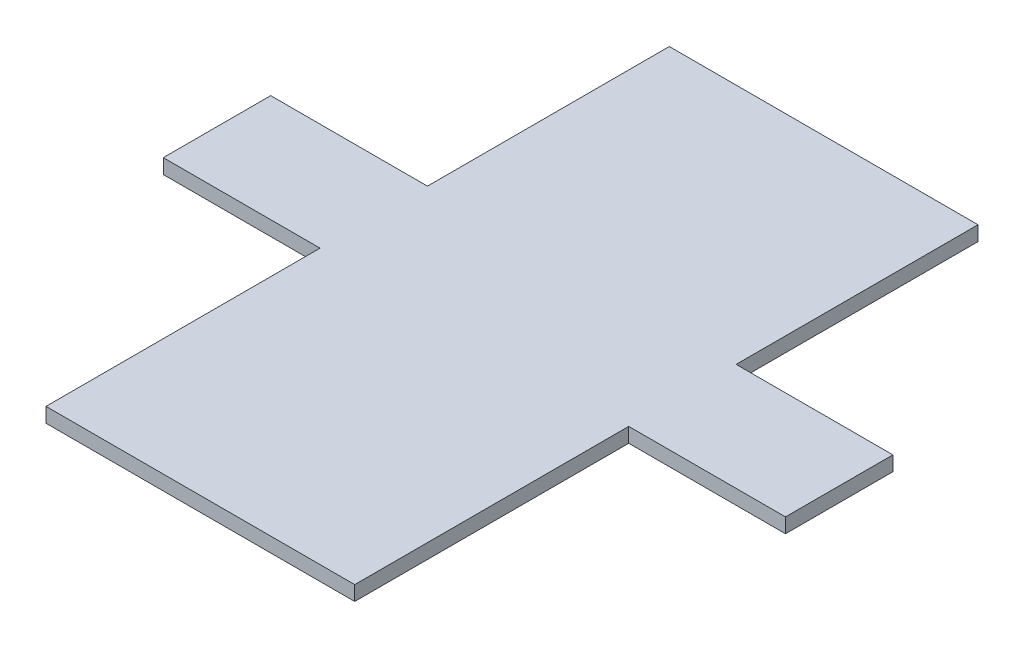
ISO-10303-21;
HEADER;
FILE_DESCRIPTION(('STEP AP214'),'2;1');
FILE_NAME('part.step','',(''),(''),'','','');
FILE_SCHEMA(('AUTOMOTIVE_DESIGN { 1 0 10303 214 1 1 1 1 }'));
ENDSEC;
DATA;
#1=APPLICATION_CONTEXT('core data for automotive mechanical design processes');
#2=APPLICATION_PROTOCOL_DEFINITION('international standard','automotive_design',2000,#1);
#3=PRODUCT_CONTEXT('',#1,'mechanical');
#4=PRODUCT('Part','Part','',(#3));
#5=PRODUCT_RELATED_PRODUCT_CATEGORY('part','',(#4));
#6=PRODUCT_DEFINITION_FORMATION('','',#4);
#7=PRODUCT_DEFINITION_CONTEXT('part definition',#1,'design');
#8=PRODUCT_DEFINITION('design','',#6,#7);
#9=PRODUCT_DEFINITION_SHAPE('','',#8);
#10=(LENGTH_UNIT() NAMED_UNIT(*) SI_UNIT(.MILLI.,.METRE.));
#11=(NAMED_UNIT(*) PLANE_ANGLE_UNIT() SI_UNIT($,.RADIAN.));
#12=(NAMED_UNIT(*) SI_UNIT($,.STERADIAN.) SOLID_ANGLE_UNIT());
#13=UNCERTAINTY_MEASURE_WITH_UNIT(LENGTH_MEASURE(1.E-05),#10,'distance_accuracy_value','');
#14=(GEOMETRIC_REPRESENTATION_CONTEXT(3) GLOBAL_UNCERTAINTY_ASSIGNED_CONTEXT((#13)) GLOBAL_UNIT_ASSIGNED_CONTEXT((#10,
#11,#12)) REPRESENTATION_CONTEXT('',''));
#15=CARTESIAN_POINT('',(0.,0.,0.));
#16=DIRECTION('',(0.,0.,1.));
#17=DIRECTION('',(1.,0.,0.));
#18=AXIS2_PLACEMENT_3D('',#15,#16,#17);
#19=CARTESIAN_POINT('',(0.,1.87,-48.72));
#20=DIRECTION('',(-1.,0.,0.));
#21=DIRECTION('',(0.,0.,1.));
#22=AXIS2_PLACEMENT_3D('',#19,#20,#21);
#23=PLANE('',#22);
#24=DIRECTION('',(0.,0.,-1.));
#25=VECTOR('',#24,1.);
#26=CARTESIAN_POINT('',(0.,0.,-48.72));
#27=LINE('',#26,#25);
#28=CARTESIAN_POINT('',(0.,0.,-48.72));
#29=VERTEX_POINT('',#28);
#30=CARTESIAN_POINT('',(0.,0.,-79.61));
#31=VERTEX_POINT('',#30);
#32=EDGE_CURVE('E159',#29,#31,#27,.T.);
#33=ORIENTED_EDGE('',*,*,#32,.F.);
#34=DIRECTION('',(0.,-1.,0.));
#35=VECTOR('',#34,1.);
#36=CARTESIAN_POINT('',(0.,1.87,-48.72));
#37=LINE('',#36,#35);
#38=CARTESIAN_POINT('',(0.,1.87,-48.72));
#39=VERTEX_POINT('',#38);
#40=EDGE_CURVE('E11',#39,#29,#37,.T.);
#41=ORIENTED_EDGE('',*,*,#40,.F.);
#42=DIRECTION('',(0.,0.,-1.));
#43=VECTOR('',#42,1.);
#44=CARTESIAN_POINT('',(0.,1.87,-48.72));
#45=LINE('',#44,#43);
#46=CARTESIAN_POINT('',(0.,1.87,-79.61));
#47=VERTEX_POINT('',#46);
#48=EDGE_CURVE('E183',#39,#47,#45,.T.);
#49=ORIENTED_EDGE('',*,*,#48,.T.);
#50=DIRECTION('',(0.,-1.,0.));
#51=VECTOR('',#50,1.);
#52=CARTESIAN_POINT('',(0.,1.87,-79.61));
#53=LINE('',#52,#51);
#54=EDGE_CURVE('E40',#47,#31,#53,.T.);
#55=ORIENTED_EDGE('',*,*,#54,.T.);
#56=EDGE_LOOP('',(#33,#41,#49,#55));
#57=FACE_BOUND('',#56,.T.);
#58=ADVANCED_FACE('F37',(#57),#23,.T.);
#59=CARTESIAN_POINT('',(0.,1.87,-48.72));
#60=DIRECTION('',(0.,0.,1.));
#61=DIRECTION('',(1.,0.,0.));
#62=AXIS2_PLACEMENT_3D('',#59,#60,#61);
#63=PLANE('',#62);
#64=DIRECTION('',(-1.,0.,0.));
#65=VECTOR('',#64,1.);
#66=CARTESIAN_POINT('',(0.,0.,-48.72));
#67=LINE('',#66,#65);
#68=CARTESIAN_POINT('',(-20.02,0.,-48.72));
#69=VERTEX_POINT('',#68);
#70=EDGE_CURVE('E94',#29,#69,#67,.T.);
#71=ORIENTED_EDGE('',*,*,#70,.T.);
#72=DIRECTION('',(0.,-1.,0.));
#73=VECTOR('',#72,1.);
#74=CARTESIAN_POINT('',(-20.02,1.87,-48.72));
#75=LINE('',#74,#73);
#76=CARTESIAN_POINT('',(-20.02,1.87,-48.72));
#77=VERTEX_POINT('',#76);
#78=EDGE_CURVE('E46',#77,#69,#75,.T.);
#79=ORIENTED_EDGE('',*,*,#78,.F.);
#80=DIRECTION('',(-1.,0.,0.));
#81=VECTOR('',#80,1.);
#82=CARTESIAN_POINT('',(0.,1.87,-48.72));
#83=LINE('',#82,#81);
#84=EDGE_CURVE('E137',#39,#77,#83,.T.);
#85=ORIENTED_EDGE('',*,*,#84,.F.);
#86=ORIENTED_EDGE('',*,*,#40,.T.);
#87=EDGE_LOOP('',(#71,#79,#85,#86));
#88=FACE_BOUND('',#87,.T.);
#89=ADVANCED_FACE('F264',(#88),#63,.F.);
#90=CARTESIAN_POINT('',(-20.02,1.87,-48.72));
#91=DIRECTION('',(1.,0.,0.));
#92=DIRECTION('',(0.,0.,-1.));
#93=AXIS2_PLACEMENT_3D('',#90,#91,#92);
#94=PLANE('',#93);
#95=DIRECTION('',(0.,0.,1.));
#96=VECTOR('',#95,1.);
#97=CARTESIAN_POINT('',(-20.02,0.,-48.72));
#98=LINE('',#97,#96);
#99=CARTESIAN_POINT('',(-20.02,0.,-35.));
#100=VERTEX_POINT('',#99);
#101=EDGE_CURVE('E144',#69,#100,#98,.T.);
#102=ORIENTED_EDGE('',*,*,#101,.T.);
#103=DIRECTION('',(0.,-1.,0.));
#104=VECTOR('',#103,1.);
#105=CARTESIAN_POINT('',(-20.02,1.87,-35.));
#106=LINE('',#105,#104);
#107=CARTESIAN_POINT('',(-20.02,1.87,-35.));
#108=VERTEX_POINT('',#107);
#109=EDGE_CURVE('E141',#108,#100,#106,.T.);
#110=ORIENTED_EDGE('',*,*,#109,.F.);
#111=DIRECTION('',(0.,0.,1.));
#112=VECTOR('',#111,1.);
#113=CARTESIAN_POINT('',(-20.02,1.87,-48.72));
#114=LINE('',#113,#112);
#115=EDGE_CURVE('E130',#77,#108,#114,.T.);
#116=ORIENTED_EDGE('',*,*,#115,.F.);
#117=ORIENTED_EDGE('',*,*,#78,.T.);
#118=EDGE_LOOP('',(#102,#110,#116,#117));
#119=FACE_BOUND('',#118,.T.);
#120=ADVANCED_FACE('F142',(#119),#94,.F.);
#121=CARTESIAN_POINT('',(-20.02,1.87,-35.));
#122=DIRECTION('',(0.,0.,-1.));
#123=DIRECTION('',(-1.,0.,0.));
#124=AXIS2_PLACEMENT_3D('',#121,#122,#123);
#125=PLANE('',#124);
#126=DIRECTION('',(1.,0.,0.));
#127=VECTOR('',#126,1.);
#128=CARTESIAN_POINT('',(-20.02,0.,-35.));
#129=LINE('',#128,#127);
#130=CARTESIAN_POINT('',(0.,0.,-35.));
#131=VERTEX_POINT('',#130);
#132=EDGE_CURVE('E180',#100,#131,#129,.T.);
#133=ORIENTED_EDGE('',*,*,#132,.T.);
#134=DIRECTION('',(0.,-1.,0.));
#135=VECTOR('',#134,1.);
#136=CARTESIAN_POINT('',(0.,1.87,-35.));
#137=LINE('',#136,#135);
#138=CARTESIAN_POINT('',(0.,1.87,-35.));
#139=VERTEX_POINT('',#138);
#140=EDGE_CURVE('E147',#139,#131,#137,.T.);
#141=ORIENTED_EDGE('',*,*,#140,.F.);
#142=DIRECTION('',(1.,0.,0.));
#143=VECTOR('',#142,1.);
#144=CARTESIAN_POINT('',(-20.02,1.87,-35.));
#145=LINE('',#144,#143);
#146=EDGE_CURVE('E135',#108,#139,#145,.T.);
#147=ORIENTED_EDGE('',*,*,#146,.F.);
#148=ORIENTED_EDGE('',*,*,#109,.T.);
#149=EDGE_LOOP('',(#133,#141,#147,#148));
#150=FACE_BOUND('',#149,.T.);
#151=ADVANCED_FACE('F149',(#150),#125,.F.);
#152=CARTESIAN_POINT('',(0.,1.87,-35.));
#153=DIRECTION('',(1.,0.,0.));
#154=DIRECTION('',(0.,0.,-1.));
#155=AXIS2_PLACEMENT_3D('',#152,#153,#154);
#156=PLANE('',#155);
#157=DIRECTION('',(0.,0.,1.));
#158=VECTOR('',#157,1.);
#159=CARTESIAN_POINT('',(0.,0.,-35.));
#160=LINE('',#159,#158);
#161=CARTESIAN_POINT('',(0.,0.,0.));
#162=VERTEX_POINT('',#161);
#163=EDGE_CURVE('E178',#131,#162,#160,.T.);
#164=ORIENTED_EDGE('',*,*,#163,.T.);
#165=DIRECTION('',(0.,-1.,0.));
#166=VECTOR('',#165,1.);
#167=CARTESIAN_POINT('',(0.,1.87,0.));
#168=LINE('',#167,#166);
#169=CARTESIAN_POINT('',(0.,1.87,0.));
#170=VERTEX_POINT('',#169);
#171=EDGE_CURVE('E187',#170,#162,#168,.T.);
#172=ORIENTED_EDGE('',*,*,#171,.F.);
#173=DIRECTION('',(0.,0.,1.));
#174=VECTOR('',#173,1.);
#175=CARTESIAN_POINT('',(0.,1.87,-35.));
#176=LINE('',#175,#174);
#177=EDGE_CURVE('E152',#139,#170,#176,.T.);
#178=ORIENTED_EDGE('',*,*,#177,.F.);
#179=ORIENTED_EDGE('',*,*,#140,.T.);
#180=EDGE_LOOP('',(#164,#172,#178,#179));
#181=FACE_BOUND('',#180,.T.);
#182=ADVANCED_FACE('F213',(#181),#156,.F.);
#183=CARTESIAN_POINT('',(0.,1.87,0.));
#184=DIRECTION('',(0.,0.,-1.));
#185=DIRECTION('',(-1.,0.,0.));
#186=AXIS2_PLACEMENT_3D('',#183,#184,#185);
#187=PLANE('',#186);
#188=DIRECTION('',(1.,0.,0.));
#189=VECTOR('',#188,1.);
#190=CARTESIAN_POINT('',(0.,0.,0.));
#191=LINE('',#190,#189);
#192=CARTESIAN_POINT('',(39.43,0.,0.));
#193=VERTEX_POINT('',#192);
#194=EDGE_CURVE('E176',#162,#193,#191,.T.);
#195=ORIENTED_EDGE('',*,*,#194,.T.);
#196=DIRECTION('',(0.,-1.,0.));
#197=VECTOR('',#196,1.);
#198=CARTESIAN_POINT('',(39.43,1.87,0.));
#199=LINE('',#198,#197);
#200=CARTESIAN_POINT('',(39.43,1.87,0.));
#201=VERTEX_POINT('',#200);
#202=EDGE_CURVE('E190',#201,#193,#199,.T.);
#203=ORIENTED_EDGE('',*,*,#202,.F.);
#204=DIRECTION('',(1.,0.,0.));
#205=VECTOR('',#204,1.);
#206=CARTESIAN_POINT('',(0.,1.87,0.));
#207=LINE('',#206,#205);
#208=EDGE_CURVE('E154',#170,#201,#207,.T.);
#209=ORIENTED_EDGE('',*,*,#208,.F.);
#210=ORIENTED_EDGE('',*,*,#171,.T.);
#211=EDGE_LOOP('',(#195,#203,#209,#210));
#212=FACE_BOUND('',#211,.T.);
#213=ADVANCED_FACE('F221',(#212),#187,.F.);
#214=CARTESIAN_POINT('',(39.43,1.87,0.));
#215=DIRECTION('',(-1.,0.,0.));
#216=DIRECTION('',(0.,0.,1.));
#217=AXIS2_PLACEMENT_3D('',#214,#215,#216);
#218=PLANE('',#217);
#219=DIRECTION('',(0.,0.,-1.));
#220=VECTOR('',#219,1.);
#221=CARTESIAN_POINT('',(39.43,0.,0.));
#222=LINE('',#221,#220);
#223=CARTESIAN_POINT('',(39.43,0.,-35.));
#224=VERTEX_POINT('',#223);
#225=EDGE_CURVE('E174',#193,#224,#222,.T.);
#226=ORIENTED_EDGE('',*,*,#225,.T.);
#227=DIRECTION('',(0.,-1.,0.));
#228=VECTOR('',#227,1.);
#229=CARTESIAN_POINT('',(39.43,1.87,-35.));
#230=LINE('',#229,#228);
#231=CARTESIAN_POINT('',(39.43,1.87,-35.));
#232=VERTEX_POINT('',#231);
#233=EDGE_CURVE('E193',#232,#224,#230,.T.);
#234=ORIENTED_EDGE('',*,*,#233,.F.);
#235=DIRECTION('',(0.,0.,-1.));
#236=VECTOR('',#235,1.);
#237=CARTESIAN_POINT('',(39.43,1.87,0.));
#238=LINE('',#237,#236);
#239=EDGE_CURVE('E218',#201,#232,#238,.T.);
#240=ORIENTED_EDGE('',*,*,#239,.F.);
#241=ORIENTED_EDGE('',*,*,#202,.T.);
#242=EDGE_LOOP('',(#226,#234,#240,#241));
#243=FACE_BOUND('',#242,.T.);
#244=ADVANCED_FACE('F224',(#243),#218,.F.);
#245=CARTESIAN_POINT('',(39.43,1.87,-35.));
#246=DIRECTION('',(0.,0.,-1.));
#247=DIRECTION('',(-1.,0.,0.));
#248=AXIS2_PLACEMENT_3D('',#245,#246,#247);
#249=PLANE('',#248);
#250=DIRECTION('',(1.,0.,0.));
#251=VECTOR('',#250,1.);
#252=CARTESIAN_POINT('',(39.43,0.,-35.));
#253=LINE('',#252,#251);
#254=CARTESIAN_POINT('',(59.45,0.,-35.));
#255=VERTEX_POINT('',#254);
#256=EDGE_CURVE('E172',#224,#255,#253,.T.);
#257=ORIENTED_EDGE('',*,*,#256,.T.);
#258=DIRECTION('',(0.,-1.,0.));
#259=VECTOR('',#258,1.);
#260=CARTESIAN_POINT('',(59.45,1.87,-35.));
#261=LINE('',#260,#259);
#262=CARTESIAN_POINT('',(59.45,1.87,-35.));
#263=VERTEX_POINT('',#262);
#264=EDGE_CURVE('E196',#263,#255,#261,.T.);
#265=ORIENTED_EDGE('',*,*,#264,.F.);
#266=DIRECTION('',(1.,0.,0.));
#267=VECTOR('',#266,1.);
#268=CARTESIAN_POINT('',(39.43,1.87,-35.));
#269=LINE('',#268,#267);
#270=EDGE_CURVE('E226',#232,#263,#269,.T.);
#271=ORIENTED_EDGE('',*,*,#270,.F.);
#272=ORIENTED_EDGE('',*,*,#233,.T.);
#273=EDGE_LOOP('',(#257,#265,#271,#272));
#274=FACE_BOUND('',#273,.T.);
#275=ADVANCED_FACE('F254',(#274),#249,.F.);
#276=CARTESIAN_POINT('',(59.45,1.87,-35.));
#277=DIRECTION('',(-1.,0.,0.));
#278=DIRECTION('',(0.,0.,1.));
#279=AXIS2_PLACEMENT_3D('',#276,#277,#278);
#280=PLANE('',#279);
#281=DIRECTION('',(0.,0.,-1.));
#282=VECTOR('',#281,1.);
#283=CARTESIAN_POINT('',(59.45,0.,-35.));
#284=LINE('',#283,#282);
#285=CARTESIAN_POINT('',(59.45,0.,-48.72));
#286=VERTEX_POINT('',#285);
#287=EDGE_CURVE('E170',#255,#286,#284,.T.);
#288=ORIENTED_EDGE('',*,*,#287,.T.);
#289=DIRECTION('',(0.,-1.,0.));
#290=VECTOR('',#289,1.);
#291=CARTESIAN_POINT('',(59.45,1.87,-48.72));
#292=LINE('',#291,#290);
#293=CARTESIAN_POINT('',(59.45,1.87,-48.72));
#294=VERTEX_POINT('',#293);
#295=EDGE_CURVE('E199',#294,#286,#292,.T.);
#296=ORIENTED_EDGE('',*,*,#295,.F.);
#297=DIRECTION('',(0.,0.,-1.));
#298=VECTOR('',#297,1.);
#299=CARTESIAN_POINT('',(59.45,1.87,-35.));
#300=LINE('',#299,#298);
#301=EDGE_CURVE('E228',#263,#294,#300,.T.);
#302=ORIENTED_EDGE('',*,*,#301,.F.);
#303=ORIENTED_EDGE('',*,*,#264,.T.);
#304=EDGE_LOOP('',(#288,#296,#302,#303));
#305=FACE_BOUND('',#304,.T.);
#306=ADVANCED_FACE('F251',(#305),#280,.F.);
#307=CARTESIAN_POINT('',(59.45,1.87,-48.72));
#308=DIRECTION('',(0.,0.,1.));
#309=DIRECTION('',(1.,0.,0.));
#310=AXIS2_PLACEMENT_3D('',#307,#308,#309);
#311=PLANE('',#310);
#312=DIRECTION('',(-1.,0.,0.));
#313=VECTOR('',#312,1.);
#314=CARTESIAN_POINT('',(59.45,0.,-48.72));
#315=LINE('',#314,#313);
#316=CARTESIAN_POINT('',(39.43,0.,-48.72));
#317=VERTEX_POINT('',#316);
#318=EDGE_CURVE('E168',#286,#317,#315,.T.);
#319=ORIENTED_EDGE('',*,*,#318,.T.);
#320=DIRECTION('',(0.,-1.,0.));
#321=VECTOR('',#320,1.);
#322=CARTESIAN_POINT('',(39.43,1.87,-48.72));
#323=LINE('',#322,#321);
#324=CARTESIAN_POINT('',(39.43,1.87,-48.72));
#325=VERTEX_POINT('',#324);
#326=EDGE_CURVE('E202',#325,#317,#323,.T.);
#327=ORIENTED_EDGE('',*,*,#326,.F.);
#328=DIRECTION('',(-1.,0.,0.));
#329=VECTOR('',#328,1.);
#330=CARTESIAN_POINT('',(59.45,1.87,-48.72));
#331=LINE('',#330,#329);
#332=EDGE_CURVE('E232',#294,#325,#331,.T.);
#333=ORIENTED_EDGE('',*,*,#332,.F.);
#334=ORIENTED_EDGE('',*,*,#295,.T.);
#335=EDGE_LOOP('',(#319,#327,#333,#334));
#336=FACE_BOUND('',#335,.T.);
#337=ADVANCED_FACE('F247',(#336),#311,.F.);
#338=CARTESIAN_POINT('',(39.43,1.87,-48.72));
#339=DIRECTION('',(-1.,0.,0.));
#340=DIRECTION('',(0.,0.,1.));
#341=AXIS2_PLACEMENT_3D('',#338,#339,#340);
#342=PLANE('',#341);
#343=DIRECTION('',(0.,0.,-1.));
#344=VECTOR('',#343,1.);
#345=CARTESIAN_POINT('',(39.43,0.,-48.72));
#346=LINE('',#345,#344);
#347=CARTESIAN_POINT('',(39.43,0.,-79.61));
#348=VERTEX_POINT('',#347);
#349=EDGE_CURVE('E165',#317,#348,#346,.T.);
#350=ORIENTED_EDGE('',*,*,#349,.T.);
#351=DIRECTION('',(0.,-1.,0.));
#352=VECTOR('',#351,1.);
#353=CARTESIAN_POINT('',(39.43,1.87,-79.61));
#354=LINE('',#353,#352);
#355=CARTESIAN_POINT('',(39.43,1.87,-79.61));
#356=VERTEX_POINT('',#355);
#357=EDGE_CURVE('E204',#356,#348,#354,.T.);
#358=ORIENTED_EDGE('',*,*,#357,.F.);
#359=DIRECTION('',(0.,0.,-1.));
#360=VECTOR('',#359,1.);
#361=CARTESIAN_POINT('',(39.43,1.87,-48.72));
#362=LINE('',#361,#360);
#363=EDGE_CURVE('E234',#325,#356,#362,.T.);
#364=ORIENTED_EDGE('',*,*,#363,.F.);
#365=ORIENTED_EDGE('',*,*,#326,.T.);
#366=EDGE_LOOP('',(#350,#358,#364,#365));
#367=FACE_BOUND('',#366,.T.);
#368=ADVANCED_FACE('F242',(#367),#342,.F.);
#369=CARTESIAN_POINT('',(0.,1.87,-79.61));
#370=DIRECTION('',(0.,0.,-1.));
#371=DIRECTION('',(-1.,0.,0.));
#372=AXIS2_PLACEMENT_3D('',#369,#370,#371);
#373=PLANE('',#372);
#374=DIRECTION('',(1.,0.,0.));
#375=VECTOR('',#374,1.);
#376=CARTESIAN_POINT('',(0.,0.,-79.61));
#377=LINE('',#376,#375);
#378=EDGE_CURVE('E162',#31,#348,#377,.T.);
#379=ORIENTED_EDGE('',*,*,#378,.F.);
#380=ORIENTED_EDGE('',*,*,#54,.F.);
#381=DIRECTION('',(1.,0.,0.));
#382=VECTOR('',#381,1.);
#383=CARTESIAN_POINT('',(0.,1.87,-79.61));
#384=LINE('',#383,#382);
#385=EDGE_CURVE('E236',#47,#356,#384,.T.);
#386=ORIENTED_EDGE('',*,*,#385,.T.);
#387=ORIENTED_EDGE('',*,*,#357,.T.);
#388=EDGE_LOOP('',(#379,#380,#386,#387));
#389=FACE_BOUND('',#388,.T.);
#390=ADVANCED_FACE('F206',(#389),#373,.T.);
#391=CARTESIAN_POINT('',(0.,1.87,0.));
#392=DIRECTION('',(0.,-1.,0.));
#393=DIRECTION('',(0.,0.,-1.));
#394=AXIS2_PLACEMENT_3D('',#391,#392,#393);
#395=PLANE('',#394);
#396=ORIENTED_EDGE('',*,*,#48,.F.);
#397=ORIENTED_EDGE('',*,*,#84,.T.);
#398=ORIENTED_EDGE('',*,*,#115,.T.);
#399=ORIENTED_EDGE('',*,*,#146,.T.);
#400=ORIENTED_EDGE('',*,*,#177,.T.);
#401=ORIENTED_EDGE('',*,*,#208,.T.);
#402=ORIENTED_EDGE('',*,*,#239,.T.);
#403=ORIENTED_EDGE('',*,*,#270,.T.);
#404=ORIENTED_EDGE('',*,*,#301,.T.);
#405=ORIENTED_EDGE('',*,*,#332,.T.);
#406=ORIENTED_EDGE('',*,*,#363,.T.);
#407=ORIENTED_EDGE('',*,*,#385,.F.);
#408=EDGE_LOOP('',(#396,#397,#398,#399,#400,#401,#402,#403,#404,#405,#406,#407));
#409=FACE_BOUND('',#408,.T.);
#410=ADVANCED_FACE('F133',(#409),#395,.F.);
#411=CARTESIAN_POINT('',(0.,0.,0.));
#412=DIRECTION('',(0.,-1.,0.));
#413=DIRECTION('',(0.,0.,-1.));
#414=AXIS2_PLACEMENT_3D('',#411,#412,#413);
#415=PLANE('',#414);
#416=ORIENTED_EDGE('',*,*,#32,.T.);
#417=ORIENTED_EDGE('',*,*,#378,.T.);
#418=ORIENTED_EDGE('',*,*,#349,.F.);
#419=ORIENTED_EDGE('',*,*,#318,.F.);
#420=ORIENTED_EDGE('',*,*,#287,.F.);
#421=ORIENTED_EDGE('',*,*,#256,.F.);
#422=ORIENTED_EDGE('',*,*,#225,.F.);
#423=ORIENTED_EDGE('',*,*,#194,.F.);
#424=ORIENTED_EDGE('',*,*,#163,.F.);
#425=ORIENTED_EDGE('',*,*,#132,.F.);
#426=ORIENTED_EDGE('',*,*,#101,.F.);
#427=ORIENTED_EDGE('',*,*,#70,.F.);
#428=EDGE_LOOP('',(#416,#417,#418,#419,#420,#421,#422,#423,#424,#425,#426,#427));
#429=FACE_BOUND('',#428,.T.);
#430=ADVANCED_FACE('F209',(#429),#415,.T.);
#431=CLOSED_SHELL('',(#58,#89,#120,#151,#182,#213,#244,#275,#306,#337,#368,#390,#410,#430));
#432=MANIFOLD_SOLID_BREP('B2',#431);
#433=ADVANCED_BREP_SHAPE_REPRESENTATION('',(#18,#432),#14);
#434=SHAPE_DEFINITION_REPRESENTATION(#9,#433);
ENDSEC;
END-ISO-10303-21;
